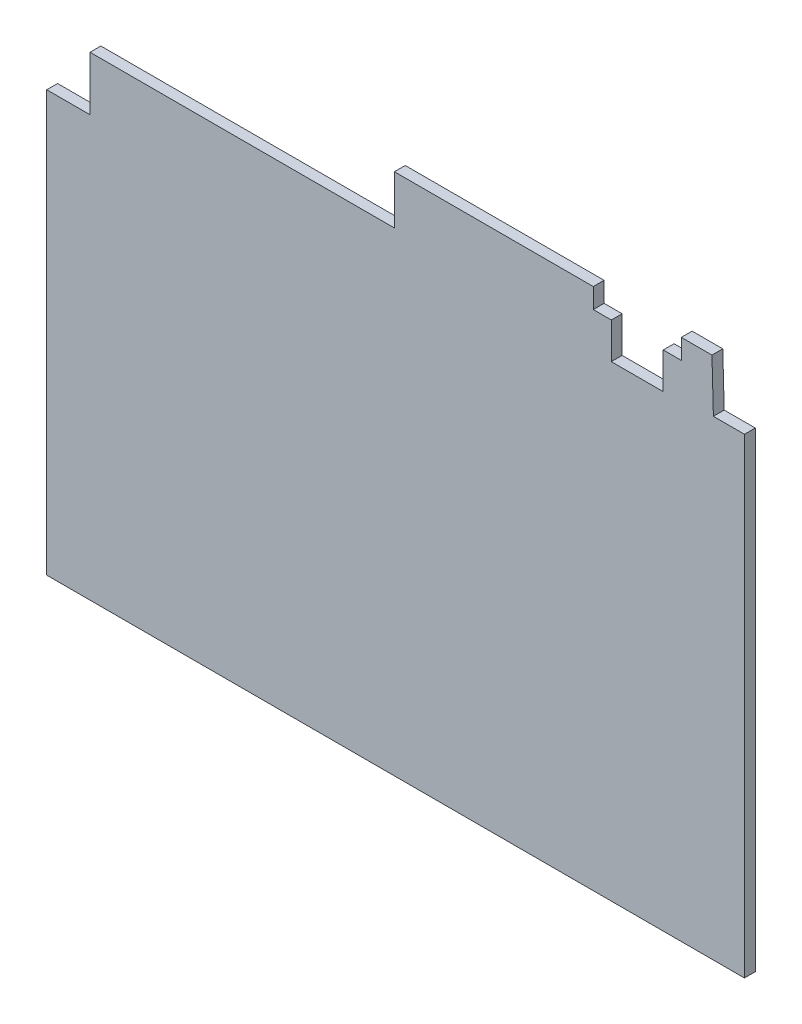
ISO-10303-21;
HEADER;
FILE_DESCRIPTION(('STEP AP214'),'2;1');
FILE_NAME('part.step','',(''),(''),'','','');
FILE_SCHEMA(('AUTOMOTIVE_DESIGN { 1 0 10303 214 1 1 1 1 }'));
ENDSEC;
DATA;
#1=APPLICATION_CONTEXT('core data for automotive mechanical design processes');
#2=APPLICATION_PROTOCOL_DEFINITION('international standard','automotive_design',2000,#1);
#3=PRODUCT_CONTEXT('',#1,'mechanical');
#4=PRODUCT('Part','Part','',(#3));
#5=PRODUCT_RELATED_PRODUCT_CATEGORY('part','',(#4));
#6=PRODUCT_DEFINITION_FORMATION('','',#4);
#7=PRODUCT_DEFINITION_CONTEXT('part definition',#1,'design');
#8=PRODUCT_DEFINITION('design','',#6,#7);
#9=PRODUCT_DEFINITION_SHAPE('','',#8);
#10=(LENGTH_UNIT() NAMED_UNIT(*) SI_UNIT(.MILLI.,.METRE.));
#11=(NAMED_UNIT(*) PLANE_ANGLE_UNIT() SI_UNIT($,.RADIAN.));
#12=(NAMED_UNIT(*) SI_UNIT($,.STERADIAN.) SOLID_ANGLE_UNIT());
#13=UNCERTAINTY_MEASURE_WITH_UNIT(LENGTH_MEASURE(1.E-05),#10,'distance_accuracy_value','');
#14=(GEOMETRIC_REPRESENTATION_CONTEXT(3) GLOBAL_UNCERTAINTY_ASSIGNED_CONTEXT((#13)) GLOBAL_UNIT_ASSIGNED_CONTEXT((#10,
#11,#12)) REPRESENTATION_CONTEXT('',''));
#15=CARTESIAN_POINT('',(0.,0.,0.));
#16=DIRECTION('',(0.,0.,1.));
#17=DIRECTION('',(1.,0.,0.));
#18=AXIS2_PLACEMENT_3D('',#15,#16,#17);
#19=CARTESIAN_POINT('',(5.41548643614652,237.051840480238,6.));
#20=DIRECTION('',(-0.99963079383079,-0.0271712352539165,0.));
#21=DIRECTION('',(0.0271712352539165,-0.99963079383079,0.));
#22=AXIS2_PLACEMENT_3D('',#19,#20,#21);
#23=PLANE('',#22);
#24=DIRECTION('',(-0.0271712352539165,0.999630793830791,0.));
#25=VECTOR('',#24,1.);
#26=CARTESIAN_POINT('',(5.41548643614652,237.051840480238,6.));
#27=LINE('',#26,#25);
#28=CARTESIAN_POINT('',(5.35976483111565,239.101840480238,6.));
#29=VERTEX_POINT('',#28);
#30=CARTESIAN_POINT('',(4.57142857142857,268.104761904762,6.));
#31=VERTEX_POINT('',#30);
#32=EDGE_CURVE('E249',#29,#31,#27,.T.);
#33=ORIENTED_EDGE('',*,*,#32,.F.);
#34=DIRECTION('',(0.,0.,1.));
#35=VECTOR('',#34,1.);
#36=CARTESIAN_POINT('',(5.35976483111565,239.101840480238,0.));
#37=LINE('',#36,#35);
#38=CARTESIAN_POINT('',(5.35976483111565,239.101840480238,0.));
#39=VERTEX_POINT('',#38);
#40=EDGE_CURVE('E177',#39,#29,#37,.T.);
#41=ORIENTED_EDGE('',*,*,#40,.F.);
#42=DIRECTION('',(-0.0271712352539165,0.999630793830791,0.));
#43=VECTOR('',#42,1.);
#44=CARTESIAN_POINT('',(5.41548643614652,237.051840480238,0.));
#45=LINE('',#44,#43);
#46=CARTESIAN_POINT('',(4.57142857142857,268.104761904762,0.));
#47=VERTEX_POINT('',#46);
#48=EDGE_CURVE('E182',#39,#47,#45,.T.);
#49=ORIENTED_EDGE('',*,*,#48,.T.);
#50=DIRECTION('',(0.,0.,-1.));
#51=VECTOR('',#50,1.);
#52=CARTESIAN_POINT('',(4.57142857142857,268.104761904762,6.));
#53=LINE('',#52,#51);
#54=EDGE_CURVE('E287',#31,#47,#53,.T.);
#55=ORIENTED_EDGE('',*,*,#54,.F.);
#56=EDGE_LOOP('',(#33,#41,#49,#55));
#57=FACE_BOUND('',#56,.T.);
#58=ADVANCED_FACE('F35',(#57),#23,.F.);
#59=CARTESIAN_POINT('',(4.57142857142857,268.104761904762,6.));
#60=DIRECTION('',(0.,-1.,0.));
#61=DIRECTION('',(0.,0.,-1.));
#62=AXIS2_PLACEMENT_3D('',#59,#60,#61);
#63=PLANE('',#62);
#64=DIRECTION('',(-1.,0.,0.));
#65=VECTOR('',#64,1.);
#66=CARTESIAN_POINT('',(4.57142857142857,268.104761904762,0.));
#67=LINE('',#66,#65);
#68=CARTESIAN_POINT('',(-12.4285714285714,268.104761904762,0.));
#69=VERTEX_POINT('',#68);
#70=EDGE_CURVE('E268',#47,#69,#67,.T.);
#71=ORIENTED_EDGE('',*,*,#70,.T.);
#72=DIRECTION('',(0.,0.,-1.));
#73=VECTOR('',#72,1.);
#74=CARTESIAN_POINT('',(-12.4285714285714,268.104761904762,6.));
#75=LINE('',#74,#73);
#76=CARTESIAN_POINT('',(-12.4285714285714,268.104761904762,6.));
#77=VERTEX_POINT('',#76);
#78=EDGE_CURVE('E284',#77,#69,#75,.T.);
#79=ORIENTED_EDGE('',*,*,#78,.F.);
#80=DIRECTION('',(-1.,0.,0.));
#81=VECTOR('',#80,1.);
#82=CARTESIAN_POINT('',(4.57142857142857,268.104761904762,6.));
#83=LINE('',#82,#81);
#84=EDGE_CURVE('E251',#31,#77,#83,.T.);
#85=ORIENTED_EDGE('',*,*,#84,.F.);
#86=ORIENTED_EDGE('',*,*,#54,.T.);
#87=EDGE_LOOP('',(#71,#79,#85,#86));
#88=FACE_BOUND('',#87,.T.);
#89=ADVANCED_FACE('F352',(#88),#63,.F.);
#90=CARTESIAN_POINT('',(-12.4285714285714,268.104761904762,6.));
#91=DIRECTION('',(1.,0.,0.));
#92=DIRECTION('',(0.,0.,-1.));
#93=AXIS2_PLACEMENT_3D('',#90,#91,#92);
#94=PLANE('',#93);
#95=DIRECTION('',(0.,-1.,0.));
#96=VECTOR('',#95,1.);
#97=CARTESIAN_POINT('',(-12.4285714285714,268.104761904762,0.));
#98=LINE('',#97,#96);
#99=CARTESIAN_POINT('',(-12.4285714285714,257.051840480238,0.));
#100=VERTEX_POINT('',#99);
#101=EDGE_CURVE('E270',#69,#100,#98,.T.);
#102=ORIENTED_EDGE('',*,*,#101,.T.);
#103=DIRECTION('',(0.,0.,1.));
#104=VECTOR('',#103,1.);
#105=CARTESIAN_POINT('',(-12.4285714285714,257.051840480238,0.));
#106=LINE('',#105,#104);
#107=CARTESIAN_POINT('',(-12.4285714285714,257.051840480238,6.));
#108=VERTEX_POINT('',#107);
#109=EDGE_CURVE('E213',#100,#108,#106,.T.);
#110=ORIENTED_EDGE('',*,*,#109,.T.);
#111=DIRECTION('',(0.,-1.,0.));
#112=VECTOR('',#111,1.);
#113=CARTESIAN_POINT('',(-12.4285714285714,268.104761904762,6.));
#114=LINE('',#113,#112);
#115=EDGE_CURVE('E254',#77,#108,#114,.T.);
#116=ORIENTED_EDGE('',*,*,#115,.F.);
#117=ORIENTED_EDGE('',*,*,#78,.T.);
#118=EDGE_LOOP('',(#102,#110,#116,#117));
#119=FACE_BOUND('',#118,.T.);
#120=ADVANCED_FACE('F357',(#119),#94,.F.);
#121=CARTESIAN_POINT('',(-12.4285714285714,237.051840480238,6.));
#122=DIRECTION('',(0.,-1.,0.));
#123=DIRECTION('',(0.,0.,-1.));
#124=AXIS2_PLACEMENT_3D('',#121,#122,#123);
#125=PLANE('',#124);
#126=DIRECTION('',(-1.,0.,0.));
#127=VECTOR('',#126,1.);
#128=CARTESIAN_POINT('',(-12.4285714285714,237.051840480238,0.));
#129=LINE('',#128,#127);
#130=CARTESIAN_POINT('',(-22.4285714285714,237.051840480238,0.));
#131=VERTEX_POINT('',#130);
#132=CARTESIAN_POINT('',(-51.2165959121275,237.051840480238,0.));
#133=VERTEX_POINT('',#132);
#134=EDGE_CURVE('E54',#131,#133,#129,.T.);
#135=ORIENTED_EDGE('',*,*,#134,.T.);
#136=DIRECTION('',(0.,0.,1.));
#137=VECTOR('',#136,1.);
#138=CARTESIAN_POINT('',(-51.2165959121275,237.051840480238,0.));
#139=LINE('',#138,#137);
#140=CARTESIAN_POINT('',(-51.2165959121275,237.051840480238,6.));
#141=VERTEX_POINT('',#140);
#142=EDGE_CURVE('E49',#133,#141,#139,.T.);
#143=ORIENTED_EDGE('',*,*,#142,.T.);
#144=DIRECTION('',(-1.,0.,0.));
#145=VECTOR('',#144,1.);
#146=CARTESIAN_POINT('',(-12.4285714285714,237.051840480238,6.));
#147=LINE('',#146,#145);
#148=CARTESIAN_POINT('',(-22.4285714285714,237.051840480238,6.));
#149=VERTEX_POINT('',#148);
#150=EDGE_CURVE('E257',#149,#141,#147,.T.);
#151=ORIENTED_EDGE('',*,*,#150,.F.);
#152=DIRECTION('',(0.,0.,1.));
#153=VECTOR('',#152,1.);
#154=CARTESIAN_POINT('',(-22.4285714285714,237.051840480238,0.));
#155=LINE('',#154,#153);
#156=EDGE_CURVE('E218',#131,#149,#155,.T.);
#157=ORIENTED_EDGE('',*,*,#156,.F.);
#158=EDGE_LOOP('',(#135,#143,#151,#157));
#159=FACE_BOUND('',#158,.T.);
#160=ADVANCED_FACE('F391',(#159),#125,.F.);
#161=CARTESIAN_POINT('',(-38.2165959121275,268.104761904762,6.));
#162=DIRECTION('',(0.,-1.,0.));
#163=DIRECTION('',(1.,0.,0.));
#164=AXIS2_PLACEMENT_3D('',#161,#162,#163);
#165=PLANE('',#164);
#166=DIRECTION('',(-1.,0.,0.));
#167=VECTOR('',#166,1.);
#168=CARTESIAN_POINT('',(-38.2165959121275,268.104761904762,6.));
#169=LINE('',#168,#167);
#170=CARTESIAN_POINT('',(-61.2165959121275,268.104761904762,6.));
#171=VERTEX_POINT('',#170);
#172=CARTESIAN_POINT('',(-171.428571428571,268.104761904762,6.));
#173=VERTEX_POINT('',#172);
#174=EDGE_CURVE('E259',#171,#173,#169,.T.);
#175=ORIENTED_EDGE('',*,*,#174,.F.);
#176=DIRECTION('',(0.,0.,1.));
#177=VECTOR('',#176,1.);
#178=CARTESIAN_POINT('',(-61.2165959121275,268.104761904762,-4.));
#179=LINE('',#178,#177);
#180=CARTESIAN_POINT('',(-61.2165959121275,268.104761904762,0.));
#181=VERTEX_POINT('',#180);
#182=EDGE_CURVE('E226',#181,#171,#179,.T.);
#183=ORIENTED_EDGE('',*,*,#182,.F.);
#184=DIRECTION('',(-1.,0.,0.));
#185=VECTOR('',#184,1.);
#186=CARTESIAN_POINT('',(-38.2165959121275,268.104761904762,0.));
#187=LINE('',#186,#185);
#188=CARTESIAN_POINT('',(-171.428571428571,268.104761904762,0.));
#189=VERTEX_POINT('',#188);
#190=EDGE_CURVE('E273',#181,#189,#187,.T.);
#191=ORIENTED_EDGE('',*,*,#190,.T.);
#192=DIRECTION('',(0.,0.,-1.));
#193=VECTOR('',#192,1.);
#194=CARTESIAN_POINT('',(-171.428571428571,268.104761904762,6.));
#195=LINE('',#194,#193);
#196=EDGE_CURVE('E281',#173,#189,#195,.T.);
#197=ORIENTED_EDGE('',*,*,#196,.F.);
#198=EDGE_LOOP('',(#175,#183,#191,#197));
#199=FACE_BOUND('',#198,.T.);
#200=ADVANCED_FACE('F327',(#199),#165,.F.);
#201=CARTESIAN_POINT('',(-171.428571428571,268.104761904762,6.));
#202=DIRECTION('',(1.,0.,0.));
#203=DIRECTION('',(0.,1.,0.));
#204=AXIS2_PLACEMENT_3D('',#201,#202,#203);
#205=PLANE('',#204);
#206=DIRECTION('',(0.,-1.,0.));
#207=VECTOR('',#206,1.);
#208=CARTESIAN_POINT('',(-171.428571428571,268.104761904762,0.));
#209=LINE('',#208,#207);
#210=CARTESIAN_POINT('',(-171.428571428571,241.104761904762,0.));
#211=VERTEX_POINT('',#210);
#212=EDGE_CURVE('E275',#189,#211,#209,.T.);
#213=ORIENTED_EDGE('',*,*,#212,.T.);
#214=DIRECTION('',(0.,0.,-1.));
#215=VECTOR('',#214,1.);
#216=CARTESIAN_POINT('',(-171.428571428571,241.104761904762,6.));
#217=LINE('',#216,#215);
#218=CARTESIAN_POINT('',(-171.428571428571,241.104761904762,6.));
#219=VERTEX_POINT('',#218);
#220=EDGE_CURVE('E266',#219,#211,#217,.T.);
#221=ORIENTED_EDGE('',*,*,#220,.F.);
#222=DIRECTION('',(0.,-1.,0.));
#223=VECTOR('',#222,1.);
#224=CARTESIAN_POINT('',(-171.428571428571,268.104761904762,6.));
#225=LINE('',#224,#223);
#226=EDGE_CURVE('E261',#173,#219,#225,.T.);
#227=ORIENTED_EDGE('',*,*,#226,.F.);
#228=ORIENTED_EDGE('',*,*,#196,.T.);
#229=EDGE_LOOP('',(#213,#221,#227,#228));
#230=FACE_BOUND('',#229,.T.);
#231=ADVANCED_FACE('F320',(#230),#205,.F.);
#232=CARTESIAN_POINT('',(-171.428571428571,241.104761904762,6.));
#233=DIRECTION('',(0.,-1.,0.));
#234=DIRECTION('',(1.,0.,0.));
#235=AXIS2_PLACEMENT_3D('',#232,#233,#234);
#236=PLANE('',#235);
#237=DIRECTION('',(-1.,0.,0.));
#238=VECTOR('',#237,1.);
#239=CARTESIAN_POINT('',(-171.428571428571,241.104761904762,0.));
#240=LINE('',#239,#238);
#241=CARTESIAN_POINT('',(-340.123537573958,241.104761904762,0.));
#242=VERTEX_POINT('',#241);
#243=EDGE_CURVE('E252',#211,#242,#240,.T.);
#244=ORIENTED_EDGE('',*,*,#243,.T.);
#245=DIRECTION('',(0.,0.,1.));
#246=VECTOR('',#245,1.);
#247=CARTESIAN_POINT('',(-340.123537573958,241.104761904762,-4.));
#248=LINE('',#247,#246);
#249=CARTESIAN_POINT('',(-340.123537573958,241.104761904762,6.));
#250=VERTEX_POINT('',#249);
#251=EDGE_CURVE('E244',#242,#250,#248,.T.);
#252=ORIENTED_EDGE('',*,*,#251,.T.);
#253=DIRECTION('',(-1.,0.,0.));
#254=VECTOR('',#253,1.);
#255=CARTESIAN_POINT('',(-171.428571428571,241.104761904762,6.));
#256=LINE('',#255,#254);
#257=EDGE_CURVE('E263',#219,#250,#256,.T.);
#258=ORIENTED_EDGE('',*,*,#257,.F.);
#259=ORIENTED_EDGE('',*,*,#220,.T.);
#260=EDGE_LOOP('',(#244,#252,#258,#259));
#261=FACE_BOUND('',#260,.T.);
#262=ADVANCED_FACE('F315',(#261),#236,.F.);
#263=CARTESIAN_POINT('',(0.,0.,6.));
#264=DIRECTION('',(0.,0.,1.));
#265=DIRECTION('',(1.,0.,0.));
#266=AXIS2_PLACEMENT_3D('',#263,#264,#265);
#267=PLANE('',#266);
#268=DIRECTION('',(-1.,0.,0.));
#269=VECTOR('',#268,1.);
#270=CARTESIAN_POINT('',(22.5714285714282,239.101840480238,6.));
#271=LINE('',#270,#269);
#272=CARTESIAN_POINT('',(22.5714285714282,239.101840480238,6.));
#273=VERTEX_POINT('',#272);
#274=EDGE_CURVE('E176',#273,#29,#271,.T.);
#275=ORIENTED_EDGE('',*,*,#274,.T.);
#276=ORIENTED_EDGE('',*,*,#32,.T.);
#277=ORIENTED_EDGE('',*,*,#84,.T.);
#278=ORIENTED_EDGE('',*,*,#115,.T.);
#279=DIRECTION('',(-1.,0.,0.));
#280=VECTOR('',#279,1.);
#281=CARTESIAN_POINT('',(-12.4285714285714,257.051840480238,6.));
#282=LINE('',#281,#280);
#283=CARTESIAN_POINT('',(-22.4285714285714,257.051840480238,6.));
#284=VERTEX_POINT('',#283);
#285=EDGE_CURVE('E202',#108,#284,#282,.T.);
#286=ORIENTED_EDGE('',*,*,#285,.T.);
#287=DIRECTION('',(0.,-1.,0.));
#288=VECTOR('',#287,1.);
#289=CARTESIAN_POINT('',(-22.4285714285714,237.051840480238,6.));
#290=LINE('',#289,#288);
#291=EDGE_CURVE('E210',#284,#149,#290,.T.);
#292=ORIENTED_EDGE('',*,*,#291,.T.);
#293=ORIENTED_EDGE('',*,*,#150,.T.);
#294=DIRECTION('',(0.,1.,0.));
#295=VECTOR('',#294,1.);
#296=CARTESIAN_POINT('',(-51.2165959121275,237.051840480238,6.));
#297=LINE('',#296,#295);
#298=CARTESIAN_POINT('',(-51.2165959121275,257.051840480238,6.));
#299=VERTEX_POINT('',#298);
#300=EDGE_CURVE('E186',#141,#299,#297,.T.);
#301=ORIENTED_EDGE('',*,*,#300,.T.);
#302=DIRECTION('',(-1.,0.,0.));
#303=VECTOR('',#302,1.);
#304=CARTESIAN_POINT('',(-61.2165959121275,257.051840480238,6.));
#305=LINE('',#304,#303);
#306=CARTESIAN_POINT('',(-61.2165959121275,257.051840480238,6.));
#307=VERTEX_POINT('',#306);
#308=EDGE_CURVE('E192',#299,#307,#305,.T.);
#309=ORIENTED_EDGE('',*,*,#308,.T.);
#310=DIRECTION('',(0.,-1.,0.));
#311=VECTOR('',#310,1.);
#312=CARTESIAN_POINT('',(-61.2165959121275,237.051840480238,6.));
#313=LINE('',#312,#311);
#314=EDGE_CURVE('E221',#171,#307,#313,.T.);
#315=ORIENTED_EDGE('',*,*,#314,.F.);
#316=ORIENTED_EDGE('',*,*,#174,.T.);
#317=ORIENTED_EDGE('',*,*,#226,.T.);
#318=ORIENTED_EDGE('',*,*,#257,.T.);
#319=DIRECTION('',(0.,1.,0.));
#320=VECTOR('',#319,1.);
#321=CARTESIAN_POINT('',(-340.123537573958,241.104761904762,6.));
#322=LINE('',#321,#320);
#323=CARTESIAN_POINT('',(-340.123537573958,211.104761904762,6.));
#324=VERTEX_POINT('',#323);
#325=EDGE_CURVE('E241',#324,#250,#322,.T.);
#326=ORIENTED_EDGE('',*,*,#325,.F.);
#327=DIRECTION('',(1.,0.,0.));
#328=VECTOR('',#327,1.);
#329=CARTESIAN_POINT('',(-370.123537573958,211.104761904762,6.));
#330=LINE('',#329,#328);
#331=CARTESIAN_POINT('',(-364.123537573958,211.104761904762,6.));
#332=VERTEX_POINT('',#331);
#333=EDGE_CURVE('E239',#332,#324,#330,.T.);
#334=ORIENTED_EDGE('',*,*,#333,.F.);
#335=DIRECTION('',(0.,1.,0.));
#336=VECTOR('',#335,1.);
#337=CARTESIAN_POINT('',(-364.123537573958,-21.8952380952382,6.));
#338=LINE('',#337,#336);
#339=CARTESIAN_POINT('',(-364.123537573958,-21.8952380952382,6.));
#340=VERTEX_POINT('',#339);
#341=EDGE_CURVE('E229',#340,#332,#338,.T.);
#342=ORIENTED_EDGE('',*,*,#341,.F.);
#343=DIRECTION('',(-1.,0.,0.));
#344=VECTOR('',#343,1.);
#345=CARTESIAN_POINT('',(-370.123537573958,-21.8952380952382,6.));
#346=LINE('',#345,#344);
#347=CARTESIAN_POINT('',(22.5714285714282,-21.8952380952382,6.));
#348=VERTEX_POINT('',#347);
#349=EDGE_CURVE('E236',#348,#340,#346,.T.);
#350=ORIENTED_EDGE('',*,*,#349,.F.);
#351=DIRECTION('',(0.,-1.,0.));
#352=VECTOR('',#351,1.);
#353=CARTESIAN_POINT('',(22.5714285714282,-21.8952380952382,6.));
#354=LINE('',#353,#352);
#355=EDGE_CURVE('E228',#273,#348,#354,.T.);
#356=ORIENTED_EDGE('',*,*,#355,.F.);
#357=EDGE_LOOP('',(#275,#276,#277,#278,#286,#292,#293,#301,#309,#315,#316,#317,#318,#326,#334,
#342,#350,#356));
#358=FACE_BOUND('',#357,.T.);
#359=ADVANCED_FACE('F332',(#358),#267,.T.);
#360=CARTESIAN_POINT('',(0.,0.,0.));
#361=DIRECTION('',(0.,0.,1.));
#362=DIRECTION('',(1.,0.,0.));
#363=AXIS2_PLACEMENT_3D('',#360,#361,#362);
#364=PLANE('',#363);
#365=ORIENTED_EDGE('',*,*,#48,.F.);
#366=DIRECTION('',(-1.,0.,0.));
#367=VECTOR('',#366,1.);
#368=CARTESIAN_POINT('',(22.5714285714282,239.101840480238,0.));
#369=LINE('',#368,#367);
#370=CARTESIAN_POINT('',(22.5714285714282,239.101840480238,0.));
#371=VERTEX_POINT('',#370);
#372=EDGE_CURVE('E173',#371,#39,#369,.T.);
#373=ORIENTED_EDGE('',*,*,#372,.F.);
#374=DIRECTION('',(0.,-1.,0.));
#375=VECTOR('',#374,1.);
#376=CARTESIAN_POINT('',(22.5714285714282,0.,0.));
#377=LINE('',#376,#375);
#378=CARTESIAN_POINT('',(22.5714285714282,-21.8952380952382,0.));
#379=VERTEX_POINT('',#378);
#380=EDGE_CURVE('E157',#371,#379,#377,.T.);
#381=ORIENTED_EDGE('',*,*,#380,.T.);
#382=DIRECTION('',(-1.,0.,0.));
#383=VECTOR('',#382,1.);
#384=CARTESIAN_POINT('',(0.,-21.8952380952382,0.));
#385=LINE('',#384,#383);
#386=CARTESIAN_POINT('',(-364.123537573958,-21.8952380952382,0.));
#387=VERTEX_POINT('',#386);
#388=EDGE_CURVE('E295',#379,#387,#385,.T.);
#389=ORIENTED_EDGE('',*,*,#388,.T.);
#390=DIRECTION('',(0.,1.,0.));
#391=VECTOR('',#390,1.);
#392=CARTESIAN_POINT('',(-364.123537573958,0.,0.));
#393=LINE('',#392,#391);
#394=CARTESIAN_POINT('',(-364.123537573958,211.104761904762,0.));
#395=VERTEX_POINT('',#394);
#396=EDGE_CURVE('E168',#387,#395,#393,.T.);
#397=ORIENTED_EDGE('',*,*,#396,.T.);
#398=DIRECTION('',(1.,0.,0.));
#399=VECTOR('',#398,1.);
#400=CARTESIAN_POINT('',(0.,211.104761904762,0.));
#401=LINE('',#400,#399);
#402=CARTESIAN_POINT('',(-340.123537573958,211.104761904762,0.));
#403=VERTEX_POINT('',#402);
#404=EDGE_CURVE('E290',#395,#403,#401,.T.);
#405=ORIENTED_EDGE('',*,*,#404,.T.);
#406=DIRECTION('',(0.,1.,0.));
#407=VECTOR('',#406,1.);
#408=CARTESIAN_POINT('',(-340.123537573958,0.,0.));
#409=LINE('',#408,#407);
#410=EDGE_CURVE('E292',#403,#242,#409,.T.);
#411=ORIENTED_EDGE('',*,*,#410,.T.);
#412=ORIENTED_EDGE('',*,*,#243,.F.);
#413=ORIENTED_EDGE('',*,*,#212,.F.);
#414=ORIENTED_EDGE('',*,*,#190,.F.);
#415=DIRECTION('',(0.,-1.,0.));
#416=VECTOR('',#415,1.);
#417=CARTESIAN_POINT('',(-61.2165959121275,0.,0.));
#418=LINE('',#417,#416);
#419=CARTESIAN_POINT('',(-61.2165959121275,257.051840480238,0.));
#420=VERTEX_POINT('',#419);
#421=EDGE_CURVE('E11',#181,#420,#418,.T.);
#422=ORIENTED_EDGE('',*,*,#421,.T.);
#423=DIRECTION('',(-1.,0.,0.));
#424=VECTOR('',#423,1.);
#425=CARTESIAN_POINT('',(-61.2165959121275,257.051840480238,0.));
#426=LINE('',#425,#424);
#427=CARTESIAN_POINT('',(-51.2165959121275,257.051840480238,0.));
#428=VERTEX_POINT('',#427);
#429=EDGE_CURVE('E191',#428,#420,#426,.T.);
#430=ORIENTED_EDGE('',*,*,#429,.F.);
#431=DIRECTION('',(0.,1.,0.));
#432=VECTOR('',#431,1.);
#433=CARTESIAN_POINT('',(-51.2165959121275,237.051840480238,0.));
#434=LINE('',#433,#432);
#435=EDGE_CURVE('E188',#133,#428,#434,.T.);
#436=ORIENTED_EDGE('',*,*,#435,.F.);
#437=ORIENTED_EDGE('',*,*,#134,.F.);
#438=DIRECTION('',(0.,-1.,0.));
#439=VECTOR('',#438,1.);
#440=CARTESIAN_POINT('',(-22.4285714285714,237.051840480238,0.));
#441=LINE('',#440,#439);
#442=CARTESIAN_POINT('',(-22.4285714285714,257.051840480238,0.));
#443=VERTEX_POINT('',#442);
#444=EDGE_CURVE('E209',#443,#131,#441,.T.);
#445=ORIENTED_EDGE('',*,*,#444,.F.);
#446=DIRECTION('',(-1.,0.,0.));
#447=VECTOR('',#446,1.);
#448=CARTESIAN_POINT('',(-12.4285714285714,257.051840480238,0.));
#449=LINE('',#448,#447);
#450=EDGE_CURVE('E206',#100,#443,#449,.T.);
#451=ORIENTED_EDGE('',*,*,#450,.F.);
#452=ORIENTED_EDGE('',*,*,#101,.F.);
#453=ORIENTED_EDGE('',*,*,#70,.F.);
#454=EDGE_LOOP('',(#365,#373,#381,#389,#397,#405,#411,#412,#413,#414,#422,#430,#436,#437,#445,
#451,#452,#453));
#455=FACE_BOUND('',#454,.T.);
#456=ADVANCED_FACE('F180',(#455),#364,.F.);
#457=CARTESIAN_POINT('',(-340.123537573958,241.104761904762,-4.));
#458=DIRECTION('',(1.,0.,0.));
#459=DIRECTION('',(0.,0.,-1.));
#460=AXIS2_PLACEMENT_3D('',#457,#458,#459);
#461=PLANE('',#460);
#462=DIRECTION('',(0.,0.,1.));
#463=VECTOR('',#462,1.);
#464=CARTESIAN_POINT('',(-340.123537573958,211.104761904762,-4.));
#465=LINE('',#464,#463);
#466=EDGE_CURVE('E243',#403,#324,#465,.T.);
#467=ORIENTED_EDGE('',*,*,#466,.T.);
#468=ORIENTED_EDGE('',*,*,#325,.T.);
#469=ORIENTED_EDGE('',*,*,#251,.F.);
#470=ORIENTED_EDGE('',*,*,#410,.F.);
#471=EDGE_LOOP('',(#467,#468,#469,#470));
#472=FACE_BOUND('',#471,.T.);
#473=ADVANCED_FACE('F311',(#472),#461,.F.);
#474=CARTESIAN_POINT('',(-370.123537573958,211.104761904762,-4.));
#475=DIRECTION('',(0.,-1.,0.));
#476=DIRECTION('',(0.,0.,-1.));
#477=AXIS2_PLACEMENT_3D('',#474,#475,#476);
#478=PLANE('',#477);
#479=ORIENTED_EDGE('',*,*,#404,.F.);
#480=DIRECTION('',(0.,0.,1.));
#481=VECTOR('',#480,1.);
#482=CARTESIAN_POINT('',(-364.123537573958,211.104761904762,-4.));
#483=LINE('',#482,#481);
#484=EDGE_CURVE('E169',#395,#332,#483,.T.);
#485=ORIENTED_EDGE('',*,*,#484,.T.);
#486=ORIENTED_EDGE('',*,*,#333,.T.);
#487=ORIENTED_EDGE('',*,*,#466,.F.);
#488=EDGE_LOOP('',(#479,#485,#486,#487));
#489=FACE_BOUND('',#488,.T.);
#490=ADVANCED_FACE('F306',(#489),#478,.F.);
#491=CARTESIAN_POINT('',(-370.123537573958,-21.8952380952382,-4.));
#492=DIRECTION('',(0.,1.,0.));
#493=DIRECTION('',(0.,0.,1.));
#494=AXIS2_PLACEMENT_3D('',#491,#492,#493);
#495=PLANE('',#494);
#496=ORIENTED_EDGE('',*,*,#349,.T.);
#497=DIRECTION('',(0.,0.,-1.));
#498=VECTOR('',#497,1.);
#499=CARTESIAN_POINT('',(-364.123537573958,-21.8952380952382,-4.));
#500=LINE('',#499,#498);
#501=EDGE_CURVE('E42',#340,#387,#500,.T.);
#502=ORIENTED_EDGE('',*,*,#501,.T.);
#503=ORIENTED_EDGE('',*,*,#388,.F.);
#504=DIRECTION('',(0.,0.,1.));
#505=VECTOR('',#504,1.);
#506=CARTESIAN_POINT('',(22.5714285714282,-21.8952380952382,-4.));
#507=LINE('',#506,#505);
#508=EDGE_CURVE('E163',#379,#348,#507,.T.);
#509=ORIENTED_EDGE('',*,*,#508,.T.);
#510=EDGE_LOOP('',(#496,#502,#503,#509));
#511=FACE_BOUND('',#510,.T.);
#512=ADVANCED_FACE('F299',(#511),#495,.F.);
#513=CARTESIAN_POINT('',(22.5714285714282,-21.8952380952382,-4.));
#514=DIRECTION('',(-1.,0.,0.));
#515=DIRECTION('',(0.,0.,1.));
#516=AXIS2_PLACEMENT_3D('',#513,#514,#515);
#517=PLANE('',#516);
#518=ORIENTED_EDGE('',*,*,#380,.F.);
#519=DIRECTION('',(0.,0.,1.));
#520=VECTOR('',#519,1.);
#521=CARTESIAN_POINT('',(22.5714285714282,239.101840480238,0.));
#522=LINE('',#521,#520);
#523=EDGE_CURVE('E160',#371,#273,#522,.T.);
#524=ORIENTED_EDGE('',*,*,#523,.T.);
#525=ORIENTED_EDGE('',*,*,#355,.T.);
#526=ORIENTED_EDGE('',*,*,#508,.F.);
#527=EDGE_LOOP('',(#518,#524,#525,#526));
#528=FACE_BOUND('',#527,.T.);
#529=ADVANCED_FACE('F159',(#528),#517,.F.);
#530=CARTESIAN_POINT('',(-364.123537573958,-21.8952380952382,-4.));
#531=DIRECTION('',(1.,0.,0.));
#532=DIRECTION('',(0.,0.,-1.));
#533=AXIS2_PLACEMENT_3D('',#530,#531,#532);
#534=PLANE('',#533);
#535=ORIENTED_EDGE('',*,*,#501,.F.);
#536=ORIENTED_EDGE('',*,*,#341,.T.);
#537=ORIENTED_EDGE('',*,*,#484,.F.);
#538=ORIENTED_EDGE('',*,*,#396,.F.);
#539=EDGE_LOOP('',(#535,#536,#537,#538));
#540=FACE_BOUND('',#539,.T.);
#541=ADVANCED_FACE('F363',(#540),#534,.F.);
#542=CARTESIAN_POINT('',(-61.2165959121275,237.051840480238,-4.));
#543=DIRECTION('',(-1.,0.,0.));
#544=DIRECTION('',(0.,0.,1.));
#545=AXIS2_PLACEMENT_3D('',#542,#543,#544);
#546=PLANE('',#545);
#547=ORIENTED_EDGE('',*,*,#314,.T.);
#548=DIRECTION('',(0.,0.,1.));
#549=VECTOR('',#548,1.);
#550=CARTESIAN_POINT('',(-61.2165959121275,257.051840480238,0.));
#551=LINE('',#550,#549);
#552=EDGE_CURVE('E199',#420,#307,#551,.T.);
#553=ORIENTED_EDGE('',*,*,#552,.F.);
#554=ORIENTED_EDGE('',*,*,#421,.F.);
#555=ORIENTED_EDGE('',*,*,#182,.T.);
#556=EDGE_LOOP('',(#547,#553,#554,#555));
#557=FACE_BOUND('',#556,.T.);
#558=ADVANCED_FACE('F330',(#557),#546,.F.);
#559=CARTESIAN_POINT('',(-22.4285714285714,237.051840480238,0.));
#560=DIRECTION('',(-1.,0.,0.));
#561=DIRECTION('',(0.,0.,1.));
#562=AXIS2_PLACEMENT_3D('',#559,#560,#561);
#563=PLANE('',#562);
#564=ORIENTED_EDGE('',*,*,#291,.F.);
#565=DIRECTION('',(0.,0.,1.));
#566=VECTOR('',#565,1.);
#567=CARTESIAN_POINT('',(-22.4285714285714,257.051840480238,0.));
#568=LINE('',#567,#566);
#569=EDGE_CURVE('E222',#443,#284,#568,.T.);
#570=ORIENTED_EDGE('',*,*,#569,.F.);
#571=ORIENTED_EDGE('',*,*,#444,.T.);
#572=ORIENTED_EDGE('',*,*,#156,.T.);
#573=EDGE_LOOP('',(#564,#570,#571,#572));
#574=FACE_BOUND('',#573,.T.);
#575=ADVANCED_FACE('F370',(#574),#563,.T.);
#576=CARTESIAN_POINT('',(-12.4285714285714,257.051840480238,0.));
#577=DIRECTION('',(0.,1.,0.));
#578=DIRECTION('',(0.,0.,1.));
#579=AXIS2_PLACEMENT_3D('',#576,#577,#578);
#580=PLANE('',#579);
#581=ORIENTED_EDGE('',*,*,#285,.F.);
#582=ORIENTED_EDGE('',*,*,#109,.F.);
#583=ORIENTED_EDGE('',*,*,#450,.T.);
#584=ORIENTED_EDGE('',*,*,#569,.T.);
#585=EDGE_LOOP('',(#581,#582,#583,#584));
#586=FACE_BOUND('',#585,.T.);
#587=ADVANCED_FACE('F348',(#586),#580,.T.);
#588=CARTESIAN_POINT('',(-61.2165959121275,257.051840480238,0.));
#589=DIRECTION('',(0.,1.,0.));
#590=DIRECTION('',(0.,0.,1.));
#591=AXIS2_PLACEMENT_3D('',#588,#589,#590);
#592=PLANE('',#591);
#593=ORIENTED_EDGE('',*,*,#308,.F.);
#594=DIRECTION('',(0.,0.,1.));
#595=VECTOR('',#594,1.);
#596=CARTESIAN_POINT('',(-51.2165959121275,257.051840480238,0.));
#597=LINE('',#596,#595);
#598=EDGE_CURVE('E203',#428,#299,#597,.T.);
#599=ORIENTED_EDGE('',*,*,#598,.F.);
#600=ORIENTED_EDGE('',*,*,#429,.T.);
#601=ORIENTED_EDGE('',*,*,#552,.T.);
#602=EDGE_LOOP('',(#593,#599,#600,#601));
#603=FACE_BOUND('',#602,.T.);
#604=ADVANCED_FACE('F336',(#603),#592,.T.);
#605=CARTESIAN_POINT('',(-51.2165959121275,237.051840480238,0.));
#606=DIRECTION('',(1.,0.,0.));
#607=DIRECTION('',(0.,0.,-1.));
#608=AXIS2_PLACEMENT_3D('',#605,#606,#607);
#609=PLANE('',#608);
#610=ORIENTED_EDGE('',*,*,#300,.F.);
#611=ORIENTED_EDGE('',*,*,#142,.F.);
#612=ORIENTED_EDGE('',*,*,#435,.T.);
#613=ORIENTED_EDGE('',*,*,#598,.T.);
#614=EDGE_LOOP('',(#610,#611,#612,#613));
#615=FACE_BOUND('',#614,.T.);
#616=ADVANCED_FACE('F340',(#615),#609,.T.);
#617=CARTESIAN_POINT('',(22.5714285714282,239.101840480238,0.));
#618=DIRECTION('',(0.,1.,0.));
#619=DIRECTION('',(0.,0.,1.));
#620=AXIS2_PLACEMENT_3D('',#617,#618,#619);
#621=PLANE('',#620);
#622=ORIENTED_EDGE('',*,*,#274,.F.);
#623=ORIENTED_EDGE('',*,*,#523,.F.);
#624=ORIENTED_EDGE('',*,*,#372,.T.);
#625=ORIENTED_EDGE('',*,*,#40,.T.);
#626=EDGE_LOOP('',(#622,#623,#624,#625));
#627=FACE_BOUND('',#626,.T.);
#628=ADVANCED_FACE('F172',(#627),#621,.T.);
#629=CLOSED_SHELL('',(#58,#89,#120,#160,#200,#231,#262,#359,#456,#473,#490,#512,#529,#541,#558,
#575,#587,#604,#616,#628));
#630=MANIFOLD_SOLID_BREP('B2',#629);
#631=ADVANCED_BREP_SHAPE_REPRESENTATION('',(#18,#630),#14);
#632=SHAPE_DEFINITION_REPRESENTATION(#9,#631);
ENDSEC;
END-ISO-10303-21;
